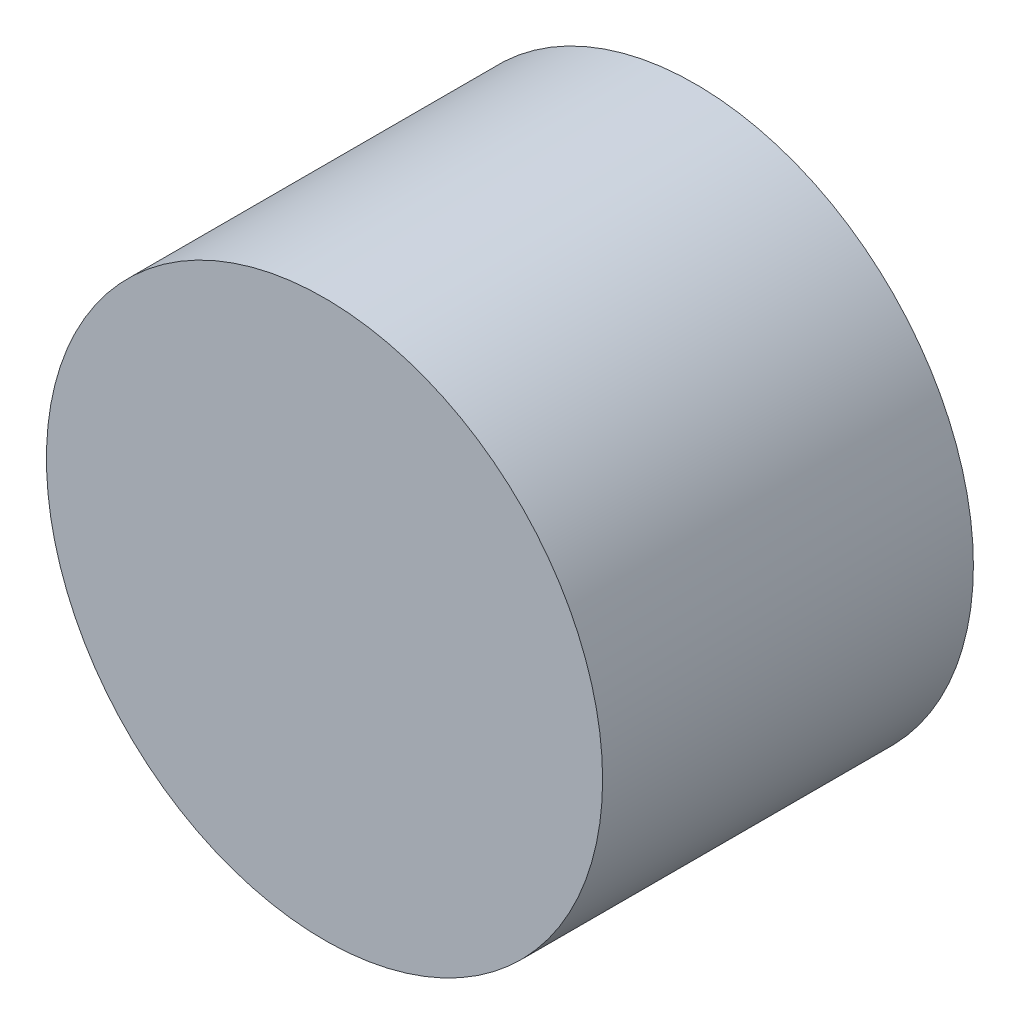
ISO-10303-21;
HEADER;
FILE_DESCRIPTION(('STEP AP214'),'2;1');
FILE_NAME('part.step','',(''),(''),'','','');
FILE_SCHEMA(('AUTOMOTIVE_DESIGN { 1 0 10303 214 1 1 1 1 }'));
ENDSEC;
DATA;
#1=APPLICATION_CONTEXT('core data for automotive mechanical design processes');
#2=APPLICATION_PROTOCOL_DEFINITION('international standard','automotive_design',2000,#1);
#3=PRODUCT_CONTEXT('',#1,'mechanical');
#4=PRODUCT('Part','Part','',(#3));
#5=PRODUCT_RELATED_PRODUCT_CATEGORY('part','',(#4));
#6=PRODUCT_DEFINITION_FORMATION('','',#4);
#7=PRODUCT_DEFINITION_CONTEXT('part definition',#1,'design');
#8=PRODUCT_DEFINITION('design','',#6,#7);
#9=PRODUCT_DEFINITION_SHAPE('','',#8);
#10=(LENGTH_UNIT() NAMED_UNIT(*) SI_UNIT(.MILLI.,.METRE.));
#11=(NAMED_UNIT(*) PLANE_ANGLE_UNIT() SI_UNIT($,.RADIAN.));
#12=(NAMED_UNIT(*) SI_UNIT($,.STERADIAN.) SOLID_ANGLE_UNIT());
#13=UNCERTAINTY_MEASURE_WITH_UNIT(LENGTH_MEASURE(1.E-05),#10,'distance_accuracy_value','');
#14=(GEOMETRIC_REPRESENTATION_CONTEXT(3) GLOBAL_UNCERTAINTY_ASSIGNED_CONTEXT((#13)) GLOBAL_UNIT_ASSIGNED_CONTEXT((#10,
#11,#12)) REPRESENTATION_CONTEXT('',''));
#15=CARTESIAN_POINT('',(0.,0.,0.));
#16=DIRECTION('',(0.,0.,1.));
#17=DIRECTION('',(1.,0.,0.));
#18=AXIS2_PLACEMENT_3D('',#15,#16,#17);
#19=CARTESIAN_POINT('',(0.,0.,80.));
#20=DIRECTION('',(0.,0.,-1.));
#21=DIRECTION('',(-1.,0.,0.));
#22=AXIS2_PLACEMENT_3D('',#19,#20,#21);
#23=CYLINDRICAL_SURFACE('',#22,60.);
#24=CARTESIAN_POINT('',(0.,0.,80.));
#25=DIRECTION('',(0.,0.,1.));
#26=DIRECTION('',(1.,0.,0.));
#27=AXIS2_PLACEMENT_3D('',#24,#25,#26);
#28=CIRCLE('',#27,60.);
#29=CARTESIAN_POINT('',(60.,0.,80.));
#30=VERTEX_POINT('',#29);
#31=EDGE_CURVE('E10',#30,#30,#28,.T.);
#32=ORIENTED_EDGE('',*,*,#31,.F.);
#33=EDGE_LOOP('',(#32));
#34=FACE_BOUND('',#33,.T.);
#35=CARTESIAN_POINT('',(0.,0.,0.));
#36=DIRECTION('',(0.,0.,1.));
#37=DIRECTION('',(1.,0.,0.));
#38=AXIS2_PLACEMENT_3D('',#35,#36,#37);
#39=CIRCLE('',#38,60.);
#40=CARTESIAN_POINT('',(60.,0.,0.));
#41=VERTEX_POINT('',#40);
#42=EDGE_CURVE('E37',#41,#41,#39,.T.);
#43=ORIENTED_EDGE('',*,*,#42,.T.);
#44=EDGE_LOOP('',(#43));
#45=FACE_BOUND('',#44,.T.);
#46=ADVANCED_FACE('F34',(#34,#45),#23,.T.);
#47=CARTESIAN_POINT('',(0.,0.,80.));
#48=DIRECTION('',(0.,0.,1.));
#49=DIRECTION('',(1.,0.,0.));
#50=AXIS2_PLACEMENT_3D('',#47,#48,#49);
#51=PLANE('',#50);
#52=ORIENTED_EDGE('',*,*,#31,.T.);
#53=EDGE_LOOP('',(#52));
#54=FACE_BOUND('',#53,.T.);
#55=ADVANCED_FACE('F49',(#54),#51,.T.);
#56=CARTESIAN_POINT('',(0.,0.,0.));
#57=DIRECTION('',(0.,0.,1.));
#58=DIRECTION('',(1.,0.,0.));
#59=AXIS2_PLACEMENT_3D('',#56,#57,#58);
#60=PLANE('',#59);
#61=ORIENTED_EDGE('',*,*,#42,.F.);
#62=EDGE_LOOP('',(#61));
#63=FACE_BOUND('',#62,.T.);
#64=ADVANCED_FACE('F47',(#63),#60,.F.);
#65=CLOSED_SHELL('',(#46,#55,#64));
#66=MANIFOLD_SOLID_BREP('B2',#65);
#67=ADVANCED_BREP_SHAPE_REPRESENTATION('',(#18,#66),#14);
#68=SHAPE_DEFINITION_REPRESENTATION(#9,#67);
ENDSEC;
END-ISO-10303-21;
